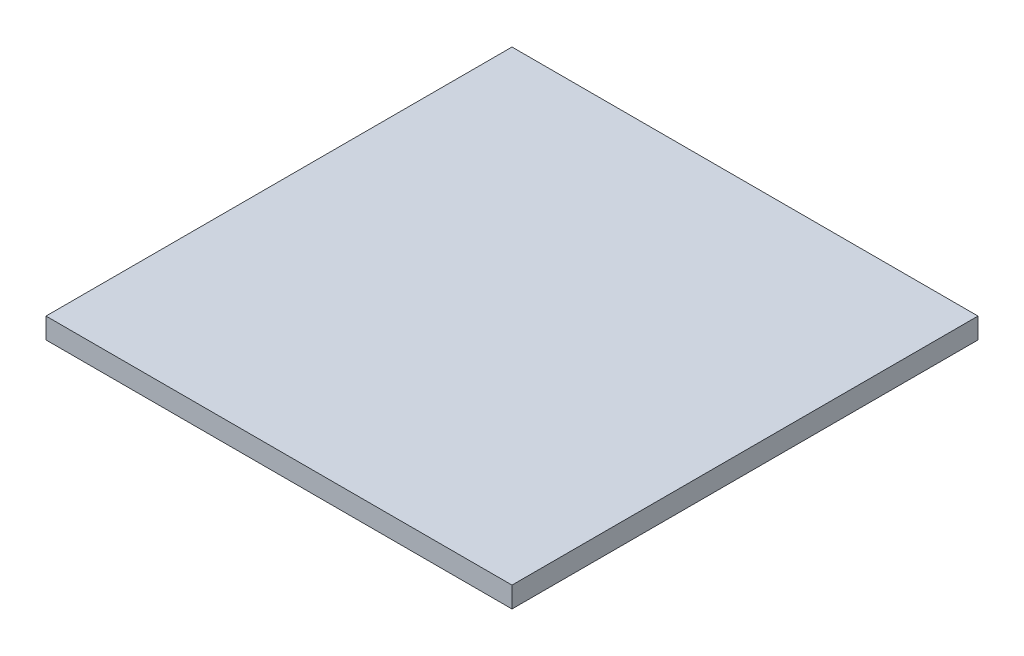
ISO-10303-21;
HEADER;
FILE_DESCRIPTION(('STEP AP214'),'2;1');
FILE_NAME('part.step','',(''),(''),'','','');
FILE_SCHEMA(('AUTOMOTIVE_DESIGN { 1 0 10303 214 1 1 1 1 }'));
ENDSEC;
DATA;
#1=APPLICATION_CONTEXT('core data for automotive mechanical design processes');
#2=APPLICATION_PROTOCOL_DEFINITION('international standard','automotive_design',2000,#1);
#3=PRODUCT_CONTEXT('',#1,'mechanical');
#4=PRODUCT('Part','Part','',(#3));
#5=PRODUCT_RELATED_PRODUCT_CATEGORY('part','',(#4));
#6=PRODUCT_DEFINITION_FORMATION('','',#4);
#7=PRODUCT_DEFINITION_CONTEXT('part definition',#1,'design');
#8=PRODUCT_DEFINITION('design','',#6,#7);
#9=PRODUCT_DEFINITION_SHAPE('','',#8);
#10=(LENGTH_UNIT() NAMED_UNIT(*) SI_UNIT(.MILLI.,.METRE.));
#11=(NAMED_UNIT(*) PLANE_ANGLE_UNIT() SI_UNIT($,.RADIAN.));
#12=(NAMED_UNIT(*) SI_UNIT($,.STERADIAN.) SOLID_ANGLE_UNIT());
#13=UNCERTAINTY_MEASURE_WITH_UNIT(LENGTH_MEASURE(1.E-05),#10,'distance_accuracy_value','');
#14=(GEOMETRIC_REPRESENTATION_CONTEXT(3) GLOBAL_UNCERTAINTY_ASSIGNED_CONTEXT((#13)) GLOBAL_UNIT_ASSIGNED_CONTEXT((#10,
#11,#12)) REPRESENTATION_CONTEXT('',''));
#15=CARTESIAN_POINT('',(0.,0.,0.));
#16=DIRECTION('',(0.,0.,1.));
#17=DIRECTION('',(1.,0.,0.));
#18=AXIS2_PLACEMENT_3D('',#15,#16,#17);
#19=CARTESIAN_POINT('',(-81.3025210084034,8.,-49.3487394957983));
#20=DIRECTION('',(1.,0.,0.));
#21=DIRECTION('',(0.,0.,-1.));
#22=AXIS2_PLACEMENT_3D('',#19,#20,#21);
#23=PLANE('',#22);
#24=DIRECTION('',(0.,0.,1.));
#25=VECTOR('',#24,1.);
#26=CARTESIAN_POINT('',(-81.3025210084034,0.,-49.3487394957983));
#27=LINE('',#26,#25);
#28=CARTESIAN_POINT('',(-81.3025210084034,0.,-49.3487394957983));
#29=VERTEX_POINT('',#28);
#30=CARTESIAN_POINT('',(-81.3025210084034,0.,130.651260504202));
#31=VERTEX_POINT('',#30);
#32=EDGE_CURVE('E98',#29,#31,#27,.T.);
#33=ORIENTED_EDGE('',*,*,#32,.T.);
#34=DIRECTION('',(0.,-1.,0.));
#35=VECTOR('',#34,1.);
#36=CARTESIAN_POINT('',(-81.3025210084034,8.,130.651260504202));
#37=LINE('',#36,#35);
#38=CARTESIAN_POINT('',(-81.3025210084034,8.,130.651260504202));
#39=VERTEX_POINT('',#38);
#40=EDGE_CURVE('E11',#39,#31,#37,.T.);
#41=ORIENTED_EDGE('',*,*,#40,.F.);
#42=DIRECTION('',(0.,0.,1.));
#43=VECTOR('',#42,1.);
#44=CARTESIAN_POINT('',(-81.3025210084034,8.,-49.3487394957983));
#45=LINE('',#44,#43);
#46=CARTESIAN_POINT('',(-81.3025210084034,8.,-49.3487394957983));
#47=VERTEX_POINT('',#46);
#48=EDGE_CURVE('E86',#47,#39,#45,.T.);
#49=ORIENTED_EDGE('',*,*,#48,.F.);
#50=DIRECTION('',(0.,-1.,0.));
#51=VECTOR('',#50,1.);
#52=CARTESIAN_POINT('',(-81.3025210084034,8.,-49.3487394957983));
#53=LINE('',#52,#51);
#54=EDGE_CURVE('E94',#47,#29,#53,.T.);
#55=ORIENTED_EDGE('',*,*,#54,.T.);
#56=EDGE_LOOP('',(#33,#41,#49,#55));
#57=FACE_BOUND('',#56,.T.);
#58=ADVANCED_FACE('F35',(#57),#23,.F.);
#59=CARTESIAN_POINT('',(-81.3025210084034,8.,130.651260504202));
#60=DIRECTION('',(0.,0.,-1.));
#61=DIRECTION('',(-1.,0.,0.));
#62=AXIS2_PLACEMENT_3D('',#59,#60,#61);
#63=PLANE('',#62);
#64=DIRECTION('',(1.,0.,0.));
#65=VECTOR('',#64,1.);
#66=CARTESIAN_POINT('',(-81.3025210084034,0.,130.651260504202));
#67=LINE('',#66,#65);
#68=CARTESIAN_POINT('',(98.6974789915966,0.,130.651260504202));
#69=VERTEX_POINT('',#68);
#70=EDGE_CURVE('E90',#31,#69,#67,.T.);
#71=ORIENTED_EDGE('',*,*,#70,.T.);
#72=DIRECTION('',(0.,-1.,0.));
#73=VECTOR('',#72,1.);
#74=CARTESIAN_POINT('',(98.6974789915966,8.,130.651260504202));
#75=LINE('',#74,#73);
#76=CARTESIAN_POINT('',(98.6974789915966,8.,130.651260504202));
#77=VERTEX_POINT('',#76);
#78=EDGE_CURVE('E43',#77,#69,#75,.T.);
#79=ORIENTED_EDGE('',*,*,#78,.F.);
#80=DIRECTION('',(1.,0.,0.));
#81=VECTOR('',#80,1.);
#82=CARTESIAN_POINT('',(-81.3025210084034,8.,130.651260504202));
#83=LINE('',#82,#81);
#84=EDGE_CURVE('E81',#39,#77,#83,.T.);
#85=ORIENTED_EDGE('',*,*,#84,.F.);
#86=ORIENTED_EDGE('',*,*,#40,.T.);
#87=EDGE_LOOP('',(#71,#79,#85,#86));
#88=FACE_BOUND('',#87,.T.);
#89=ADVANCED_FACE('F89',(#88),#63,.F.);
#90=CARTESIAN_POINT('',(98.6974789915966,8.,-49.3487394957983));
#91=DIRECTION('',(-1.,0.,0.));
#92=DIRECTION('',(0.,0.,1.));
#93=AXIS2_PLACEMENT_3D('',#90,#91,#92);
#94=PLANE('',#93);
#95=DIRECTION('',(0.,0.,-1.));
#96=VECTOR('',#95,1.);
#97=CARTESIAN_POINT('',(98.6974789915966,0.,-49.3487394957983));
#98=LINE('',#97,#96);
#99=CARTESIAN_POINT('',(98.6974789915966,0.,-49.3487394957983));
#100=VERTEX_POINT('',#99);
#101=EDGE_CURVE('E68',#69,#100,#98,.T.);
#102=ORIENTED_EDGE('',*,*,#101,.T.);
#103=DIRECTION('',(0.,-1.,0.));
#104=VECTOR('',#103,1.);
#105=CARTESIAN_POINT('',(98.6974789915966,8.,-49.3487394957983));
#106=LINE('',#105,#104);
#107=CARTESIAN_POINT('',(98.6974789915966,8.,-49.3487394957983));
#108=VERTEX_POINT('',#107);
#109=EDGE_CURVE('E91',#108,#100,#106,.T.);
#110=ORIENTED_EDGE('',*,*,#109,.F.);
#111=DIRECTION('',(0.,0.,-1.));
#112=VECTOR('',#111,1.);
#113=CARTESIAN_POINT('',(98.6974789915966,8.,-49.3487394957983));
#114=LINE('',#113,#112);
#115=EDGE_CURVE('E84',#77,#108,#114,.T.);
#116=ORIENTED_EDGE('',*,*,#115,.F.);
#117=ORIENTED_EDGE('',*,*,#78,.T.);
#118=EDGE_LOOP('',(#102,#110,#116,#117));
#119=FACE_BOUND('',#118,.T.);
#120=ADVANCED_FACE('F92',(#119),#94,.F.);
#121=CARTESIAN_POINT('',(-81.3025210084034,8.,-49.3487394957983));
#122=DIRECTION('',(0.,0.,1.));
#123=DIRECTION('',(1.,0.,0.));
#124=AXIS2_PLACEMENT_3D('',#121,#122,#123);
#125=PLANE('',#124);
#126=DIRECTION('',(-1.,0.,0.));
#127=VECTOR('',#126,1.);
#128=CARTESIAN_POINT('',(-81.3025210084034,0.,-49.3487394957983));
#129=LINE('',#128,#127);
#130=EDGE_CURVE('E74',#100,#29,#129,.T.);
#131=ORIENTED_EDGE('',*,*,#130,.T.);
#132=ORIENTED_EDGE('',*,*,#54,.F.);
#133=DIRECTION('',(-1.,0.,0.));
#134=VECTOR('',#133,1.);
#135=CARTESIAN_POINT('',(-81.3025210084034,8.,-49.3487394957983));
#136=LINE('',#135,#134);
#137=EDGE_CURVE('E51',#108,#47,#136,.T.);
#138=ORIENTED_EDGE('',*,*,#137,.F.);
#139=ORIENTED_EDGE('',*,*,#109,.T.);
#140=EDGE_LOOP('',(#131,#132,#138,#139));
#141=FACE_BOUND('',#140,.T.);
#142=ADVANCED_FACE('F105',(#141),#125,.F.);
#143=CARTESIAN_POINT('',(0.,8.,0.));
#144=DIRECTION('',(0.,1.,0.));
#145=DIRECTION('',(0.,0.,1.));
#146=AXIS2_PLACEMENT_3D('',#143,#144,#145);
#147=PLANE('',#146);
#148=ORIENTED_EDGE('',*,*,#48,.T.);
#149=ORIENTED_EDGE('',*,*,#84,.T.);
#150=ORIENTED_EDGE('',*,*,#115,.T.);
#151=ORIENTED_EDGE('',*,*,#137,.T.);
#152=EDGE_LOOP('',(#148,#149,#150,#151));
#153=FACE_BOUND('',#152,.T.);
#154=ADVANCED_FACE('F82',(#153),#147,.T.);
#155=CARTESIAN_POINT('',(0.,0.,0.));
#156=DIRECTION('',(0.,1.,0.));
#157=DIRECTION('',(0.,0.,1.));
#158=AXIS2_PLACEMENT_3D('',#155,#156,#157);
#159=PLANE('',#158);
#160=ORIENTED_EDGE('',*,*,#32,.F.);
#161=ORIENTED_EDGE('',*,*,#130,.F.);
#162=ORIENTED_EDGE('',*,*,#101,.F.);
#163=ORIENTED_EDGE('',*,*,#70,.F.);
#164=EDGE_LOOP('',(#160,#161,#162,#163));
#165=FACE_BOUND('',#164,.T.);
#166=ADVANCED_FACE('F108',(#165),#159,.F.);
#167=CLOSED_SHELL('',(#58,#89,#120,#142,#154,#166));
#168=MANIFOLD_SOLID_BREP('B2',#167);
#169=ADVANCED_BREP_SHAPE_REPRESENTATION('',(#18,#168),#14);
#170=SHAPE_DEFINITION_REPRESENTATION(#9,#169);
ENDSEC;
END-ISO-10303-21;
